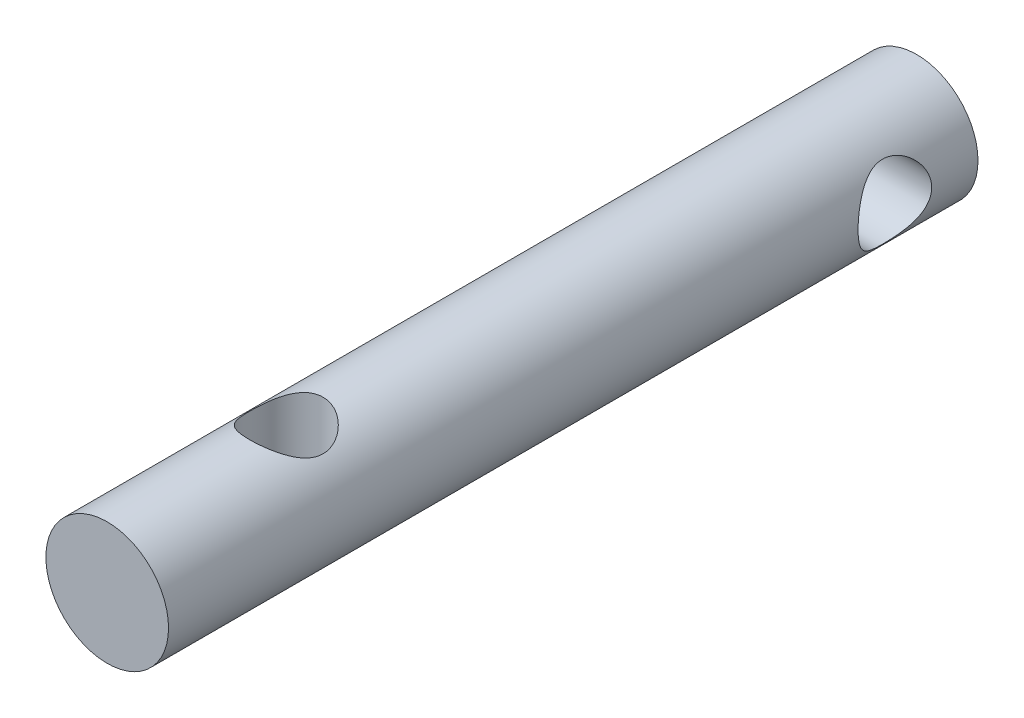
ISO-10303-21;
HEADER;
FILE_DESCRIPTION(('STEP AP214'),'2;1');
FILE_NAME('part.step','',(''),(''),'','','');
FILE_SCHEMA(('AUTOMOTIVE_DESIGN { 1 0 10303 214 1 1 1 1 }'));
ENDSEC;
DATA;
#1=APPLICATION_CONTEXT('core data for automotive mechanical design processes');
#2=APPLICATION_PROTOCOL_DEFINITION('international standard','automotive_design',2000,#1);
#3=PRODUCT_CONTEXT('',#1,'mechanical');
#4=PRODUCT('Part','Part','',(#3));
#5=PRODUCT_RELATED_PRODUCT_CATEGORY('part','',(#4));
#6=PRODUCT_DEFINITION_FORMATION('','',#4);
#7=PRODUCT_DEFINITION_CONTEXT('part definition',#1,'design');
#8=PRODUCT_DEFINITION('design','',#6,#7);
#9=PRODUCT_DEFINITION_SHAPE('','',#8);
#10=(LENGTH_UNIT() NAMED_UNIT(*) SI_UNIT(.MILLI.,.METRE.));
#11=(NAMED_UNIT(*) PLANE_ANGLE_UNIT() SI_UNIT($,.RADIAN.));
#12=(NAMED_UNIT(*) SI_UNIT($,.STERADIAN.) SOLID_ANGLE_UNIT());
#13=UNCERTAINTY_MEASURE_WITH_UNIT(LENGTH_MEASURE(1.E-05),#10,'distance_accuracy_value','');
#14=(GEOMETRIC_REPRESENTATION_CONTEXT(3) GLOBAL_UNCERTAINTY_ASSIGNED_CONTEXT((#13)) GLOBAL_UNIT_ASSIGNED_CONTEXT((#10,
#11,#12)) REPRESENTATION_CONTEXT('',''));
#15=CARTESIAN_POINT('',(0.,0.,0.));
#16=DIRECTION('',(0.,0.,1.));
#17=DIRECTION('',(1.,0.,0.));
#18=AXIS2_PLACEMENT_3D('',#15,#16,#17);
#19=CARTESIAN_POINT('',(0.,0.,41.91));
#20=DIRECTION('',(0.,0.,-1.));
#21=DIRECTION('',(-1.,0.,0.));
#22=AXIS2_PLACEMENT_3D('',#19,#20,#21);
#23=CYLINDRICAL_SURFACE('',#22,3.175);
#24=CARTESIAN_POINT('',(-3.175,0.,2.39813922282772));
#25=CARTESIAN_POINT('',(-3.17499451441265,0.0974450951319126,2.39814527041117));
#26=CARTESIAN_POINT('',(-3.17046469197759,0.195049066210574,2.40566886342358));
#27=CARTESIAN_POINT('',(-3.15277397294736,0.387319379299164,2.43538087952843));
#28=CARTESIAN_POINT('',(-3.1395917927214,0.481977872867109,2.4576054661298));
#29=CARTESIAN_POINT('',(-3.10593173484526,0.665164692998141,2.51546996246125));
#30=CARTESIAN_POINT('',(-3.08549004648014,0.753720871389695,2.55104337606543));
#31=CARTESIAN_POINT('',(-3.03905118293812,0.92332853858211,2.63418182955039));
#32=CARTESIAN_POINT('',(-3.01305538723253,1.00438188370712,2.68174389234177));
#33=CARTESIAN_POINT('',(-2.95535807693063,1.16370007405065,2.79155325763077));
#34=CARTESIAN_POINT('',(-2.9233722597582,1.24127770273718,2.85464541723817));
#35=CARTESIAN_POINT('',(-2.85788657998362,1.3854210370008,2.99182257037374));
#36=CARTESIAN_POINT('',(-2.82438481576972,1.45197239462229,3.06592165268444));
#37=CARTESIAN_POINT('',(-2.75477055048952,1.5804514580127,3.23370208157525));
#38=CARTESIAN_POINT('',(-2.71884162474122,1.64081163277819,3.3286704720845));
#39=CARTESIAN_POINT('',(-2.65351642802893,1.74449025984648,3.52951437073611));
#40=CARTESIAN_POINT('',(-2.62410958890118,1.78783637021075,3.63537182103637));
#41=CARTESIAN_POINT('',(-2.582603796677,1.84709564172948,3.82891671517688));
#42=CARTESIAN_POINT('',(-2.5680401158429,1.86710570502368,3.91481894106806));
#43=CARTESIAN_POINT('',(-2.54749691535738,1.89504538873503,4.08952994192705));
#44=CARTESIAN_POINT('',(-2.54150672347695,1.90299002887476,4.17833496234452));
#45=CARTESIAN_POINT('',(-2.53899571528976,1.90633996170635,4.35649382048514));
#46=CARTESIAN_POINT('',(-2.54249348006119,1.90172064928612,4.44584839269646));
#47=CARTESIAN_POINT('',(-2.55845642033584,1.8801849680819,4.62226326762038));
#48=CARTESIAN_POINT('',(-2.57092834088935,1.86325934967552,4.70932179355387));
#49=CARTESIAN_POINT('',(-2.60290547419199,1.81830880789855,4.87785263033051));
#50=CARTESIAN_POINT('',(-2.6223177379872,1.79043010805925,4.95938258131184));
#51=CARTESIAN_POINT('',(-2.66607355215554,1.72459728448968,5.11682186130641));
#52=CARTESIAN_POINT('',(-2.69041890951801,1.68663946719827,5.1927291167761));
#53=CARTESIAN_POINT('',(-2.7464426563161,1.59407838644418,5.35086902617369));
#54=CARTESIAN_POINT('',(-2.778658950837,1.53772519985107,5.43188740088048));
#55=CARTESIAN_POINT('',(-2.84391861700764,1.41339687835684,5.58415835708483));
#56=CARTESIAN_POINT('',(-2.8769627533293,1.34541063277735,5.65540148397788));
#57=CARTESIAN_POINT('',(-2.94558091297062,1.18848102966636,5.79616770974135));
#58=CARTESIAN_POINT('',(-2.98086572061036,1.09793745703529,5.86406740146803));
#59=CARTESIAN_POINT('',(-3.04510984111155,0.904590584082928,5.98350422276907));
#60=CARTESIAN_POINT('',(-3.07407253390404,0.801793880208324,6.03505010214096));
#61=CARTESIAN_POINT('',(-3.12077597924012,0.59334093329062,6.11661309497851));
#62=CARTESIAN_POINT('',(-3.13910925948424,0.488273882700445,6.14778292458693));
#63=CARTESIAN_POINT('',(-3.16507930373209,0.27311082683369,6.19164344353255));
#64=CARTESIAN_POINT('',(-3.17272889649977,0.163021017189872,6.20435629637476));
#65=CARTESIAN_POINT('',(-3.17615024375755,-0.0428175602592926,6.21005418937917));
#66=CARTESIAN_POINT('',(-3.17339372577143,-0.138483941241767,6.20548346878589));
#67=CARTESIAN_POINT('',(-3.15948964350551,-0.327443340522303,6.18219838942638));
#68=CARTESIAN_POINT('',(-3.14834224937907,-0.420736406907675,6.16348431746434));
#69=CARTESIAN_POINT('',(-3.11905386401582,-0.600170163840149,6.11346906315589));
#70=CARTESIAN_POINT('',(-3.10108950091445,-0.686429603679102,6.08248497950441));
#71=CARTESIAN_POINT('',(-3.05960628695812,-0.852507501340897,6.00915895484383));
#72=CARTESIAN_POINT('',(-3.03608634064869,-0.932324684704436,5.96681477361747));
#73=CARTESIAN_POINT('',(-2.98253780221448,-1.09220795378601,5.86707185923264));
#74=CARTESIAN_POINT('',(-2.95208709479649,-1.17144057107901,5.80856695989806));
#75=CARTESIAN_POINT('',(-2.88892317279907,-1.31956305976505,5.68059215309727));
#76=CARTESIAN_POINT('',(-2.85620735064672,-1.38844071148087,5.61110948616536));
#77=CARTESIAN_POINT('',(-2.78695688365568,-1.52313635853689,5.45260302748012));
#78=CARTESIAN_POINT('',(-2.75048017017815,-1.58738594929295,5.36221268828489));
#79=CARTESIAN_POINT('',(-2.68244551224696,-1.69983453424862,5.17027487162774));
#80=CARTESIAN_POINT('',(-2.6508824045697,-1.74805043804979,5.06873929959001));
#81=CARTESIAN_POINT('',(-2.60330834735534,-1.81791075064868,4.87941058449342));
#82=CARTESIAN_POINT('',(-2.58541087347737,-1.84304464157586,4.79338422611617));
#83=CARTESIAN_POINT('',(-2.55790199294049,-1.88104353179932,4.61742348368211));
#84=CARTESIAN_POINT('',(-2.54827910005326,-1.89392554099576,4.52749469959103));
#85=CARTESIAN_POINT('',(-2.53873567203593,-1.90670345557268,4.34584049931961));
#86=CARTESIAN_POINT('',(-2.53885162089826,-1.90655052898535,4.25410961443148));
#87=CARTESIAN_POINT('',(-2.54886101720431,-1.89314420926951,4.07213328982752));
#88=CARTESIAN_POINT('',(-2.55875978123279,-1.87988369266792,3.98188868496094));
#89=CARTESIAN_POINT('',(-2.5861414527098,-1.84201020214653,3.80975893171572));
#90=CARTESIAN_POINT('',(-2.60323599038313,-1.81797495311049,3.72768051015611));
#91=CARTESIAN_POINT('',(-2.6429398744415,-1.75975320921641,3.56865091254844));
#92=CARTESIAN_POINT('',(-2.66555129712813,-1.7255628914025,3.49170168080599));
#93=CARTESIAN_POINT('',(-2.71796498194149,-1.641973268796,3.33245299167821));
#94=CARTESIAN_POINT('',(-2.74833827007409,-1.59104483080574,3.25114597104719));
#95=CARTESIAN_POINT('',(-2.81076560550976,-1.47797196871254,3.09742658053055));
#96=CARTESIAN_POINT('',(-2.84282102131499,-1.41581830868474,3.02502161818392));
#97=CARTESIAN_POINT('',(-2.911166300656,-1.27012155867849,2.87902329956287));
#98=CARTESIAN_POINT('',(-2.94729305640336,-1.18474305905472,2.8071658826593));
#99=CARTESIAN_POINT('',(-3.01454081025536,-1.00135779697776,2.67868582124472));
#100=CARTESIAN_POINT('',(-3.04566001243498,-0.903346526463002,2.62206863766353));
#101=CARTESIAN_POINT('',(-3.09861734506511,-0.699890837030488,2.52794806363247));
#102=CARTESIAN_POINT('',(-3.12071031004625,-0.594765596238281,2.48991286349252));
#103=CARTESIAN_POINT('',(-3.14589516757997,-0.432421334693446,2.44701967351255));
#104=CARTESIAN_POINT('',(-3.15296108370877,-0.377590720023224,2.43508702224307));
#105=CARTESIAN_POINT('',(-3.16425617194088,-0.266820768171081,2.41608372188658));
#106=CARTESIAN_POINT('',(-3.16848770657978,-0.210882394483744,2.40900902343712));
#107=CARTESIAN_POINT('',(-3.17248369797034,-0.128982982915142,2.40233545062428));
#108=CARTESIAN_POINT('',(-3.17342617833636,-0.103222017768107,2.40076306812948));
#109=CARTESIAN_POINT('',(-3.17468506718656,-0.0516444234298966,2.39866413463696));
#110=CARTESIAN_POINT('',(-3.17500145395323,-0.0258277923389148,2.3981376199176));
#111=CARTESIAN_POINT('',(-3.175,0.,2.39813922282772));
#112=B_SPLINE_CURVE_WITH_KNOTS('',3,(#24,#25,#26,#27,#28,#29,#30,#31,#32,#33,#34,#35,#36,#37,
#38,#39,#40,#41,#42,#43,#44,#45,#46,#47,#48,#49,#50,#51,#52,#53,#54,#55,#56,#57,#58,#59,#60,#61,
#62,#63,#64,#65,#66,#67,#68,#69,#70,#71,#72,#73,#74,#75,#76,#77,#78,#79,#80,#81,#82,#83,#84,#85,
#86,#87,#88,#89,#90,#91,#92,#93,#94,#95,#96,#97,#98,#99,#100,#101,#102,#103,#104,#105,#106,#107,
#108,#109,#110,#111),.UNSPECIFIED.,.T.,.F.,(4,2,2,2,2,2,2,2,2,2,2,2,2,2,2,2,2,2,2,2,2,2,2,2,2,2,
2,2,2,2,2,2,2,2,2,2,2,2,2,2,2,2,2,4),(0.,0.292229841686784,0.585181236950415,0.876692283442014,
1.16813101145019,1.4818562023024,1.79598647577196,2.14863442751055,2.50070671678956,
2.76775963916654,3.03447984564054,3.30172277005822,3.56916676657818,3.83315549843373,
4.09724110458533,4.40749683935957,4.71805056900666,5.07188416513558,5.42552812879662,
5.7568692418463,6.08781214386159,6.37382015457481,6.65982236566588,6.9388708782601,
7.21797445986962,7.52603734589319,7.83446096403931,8.18307688283571,8.53132396622898,
8.80437389889659,9.07704418691314,9.35073600737339,9.6245766506777,9.88522404880549,
10.1459696943425,10.446748347664,10.7477756135016,11.0979497595491,11.4482492146062,
11.787830811676,11.9572649902265,12.1265577643591,12.2040105069734,12.2814659361677),.UNSPECIFIED.);
#113=CARTESIAN_POINT('',(-3.175,0.,2.39813922282772));
#114=VERTEX_POINT('',#113);
#115=EDGE_CURVE('E10',#114,#114,#112,.T.);
#116=ORIENTED_EDGE('',*,*,#115,.T.);
#117=EDGE_LOOP('',(#116));
#118=FACE_BOUND('',#117,.T.);
#119=CARTESIAN_POINT('',(3.175,0.,2.39813922282772));
#120=CARTESIAN_POINT('',(3.17499451441265,-0.0974450951319126,2.39814527041117));
#121=CARTESIAN_POINT('',(3.17046469197759,-0.195049066210574,2.40566886342358));
#122=CARTESIAN_POINT('',(3.15277397294736,-0.387319379299164,2.43538087952843));
#123=CARTESIAN_POINT('',(3.1395917927214,-0.481977872867109,2.4576054661298));
#124=CARTESIAN_POINT('',(3.10593173484526,-0.665164692998141,2.51546996246125));
#125=CARTESIAN_POINT('',(3.08549004648014,-0.753720871389695,2.55104337606543));
#126=CARTESIAN_POINT('',(3.03905118293812,-0.92332853858211,2.63418182955039));
#127=CARTESIAN_POINT('',(3.01305538723253,-1.00438188370712,2.68174389234177));
#128=CARTESIAN_POINT('',(2.95535807693063,-1.16370007405065,2.79155325763077));
#129=CARTESIAN_POINT('',(2.9233722597582,-1.24127770273718,2.85464541723817));
#130=CARTESIAN_POINT('',(2.85788657998362,-1.3854210370008,2.99182257037374));
#131=CARTESIAN_POINT('',(2.82438481576972,-1.45197239462229,3.06592165268444));
#132=CARTESIAN_POINT('',(2.75477055048952,-1.5804514580127,3.23370208157525));
#133=CARTESIAN_POINT('',(2.71884162474122,-1.64081163277819,3.3286704720845));
#134=CARTESIAN_POINT('',(2.65351642802893,-1.74449025984648,3.52951437073611));
#135=CARTESIAN_POINT('',(2.62410958890118,-1.78783637021075,3.63537182103637));
#136=CARTESIAN_POINT('',(2.582603796677,-1.84709564172948,3.82891671517688));
#137=CARTESIAN_POINT('',(2.5680401158429,-1.86710570502368,3.91481894106806));
#138=CARTESIAN_POINT('',(2.54749691535738,-1.89504538873503,4.08952994192705));
#139=CARTESIAN_POINT('',(2.54150672347695,-1.90299002887476,4.17833496234452));
#140=CARTESIAN_POINT('',(2.53899571528976,-1.90633996170635,4.35649382048514));
#141=CARTESIAN_POINT('',(2.54249348006119,-1.90172064928612,4.44584839269646));
#142=CARTESIAN_POINT('',(2.55845642033584,-1.8801849680819,4.62226326762038));
#143=CARTESIAN_POINT('',(2.57092834088935,-1.86325934967552,4.70932179355387));
#144=CARTESIAN_POINT('',(2.60290547419199,-1.81830880789855,4.87785263033051));
#145=CARTESIAN_POINT('',(2.6223177379872,-1.79043010805925,4.95938258131184));
#146=CARTESIAN_POINT('',(2.66607355215554,-1.72459728448968,5.11682186130641));
#147=CARTESIAN_POINT('',(2.69041890951801,-1.68663946719827,5.1927291167761));
#148=CARTESIAN_POINT('',(2.7464426563161,-1.59407838644418,5.35086902617369));
#149=CARTESIAN_POINT('',(2.778658950837,-1.53772519985107,5.43188740088048));
#150=CARTESIAN_POINT('',(2.84391861700764,-1.41339687835684,5.58415835708483));
#151=CARTESIAN_POINT('',(2.8769627533293,-1.34541063277735,5.65540148397788));
#152=CARTESIAN_POINT('',(2.94558091297062,-1.18848102966636,5.79616770974135));
#153=CARTESIAN_POINT('',(2.98086572061036,-1.09793745703529,5.86406740146803));
#154=CARTESIAN_POINT('',(3.04510984111155,-0.904590584082928,5.98350422276907));
#155=CARTESIAN_POINT('',(3.07407253390404,-0.801793880208324,6.03505010214096));
#156=CARTESIAN_POINT('',(3.12077597924012,-0.59334093329062,6.11661309497851));
#157=CARTESIAN_POINT('',(3.13910925948424,-0.488273882700445,6.14778292458693));
#158=CARTESIAN_POINT('',(3.16507930373209,-0.27311082683369,6.19164344353255));
#159=CARTESIAN_POINT('',(3.17272889649977,-0.163021017189872,6.20435629637476));
#160=CARTESIAN_POINT('',(3.17615024375755,0.0428175602592926,6.21005418937917));
#161=CARTESIAN_POINT('',(3.17339372577143,0.138483941241767,6.20548346878589));
#162=CARTESIAN_POINT('',(3.15948964350551,0.327443340522303,6.18219838942638));
#163=CARTESIAN_POINT('',(3.14834224937907,0.420736406907675,6.16348431746434));
#164=CARTESIAN_POINT('',(3.11905386401582,0.600170163840149,6.11346906315589));
#165=CARTESIAN_POINT('',(3.10108950091445,0.686429603679102,6.08248497950441));
#166=CARTESIAN_POINT('',(3.05960628695812,0.852507501340897,6.00915895484383));
#167=CARTESIAN_POINT('',(3.03608634064869,0.932324684704436,5.96681477361747));
#168=CARTESIAN_POINT('',(2.98253780221448,1.09220795378601,5.86707185923264));
#169=CARTESIAN_POINT('',(2.95208709479649,1.17144057107901,5.80856695989806));
#170=CARTESIAN_POINT('',(2.88892317279907,1.31956305976505,5.68059215309727));
#171=CARTESIAN_POINT('',(2.85620735064672,1.38844071148087,5.61110948616536));
#172=CARTESIAN_POINT('',(2.78695688365568,1.52313635853689,5.45260302748012));
#173=CARTESIAN_POINT('',(2.75048017017815,1.58738594929295,5.36221268828489));
#174=CARTESIAN_POINT('',(2.68244551224696,1.69983453424862,5.17027487162774));
#175=CARTESIAN_POINT('',(2.6508824045697,1.74805043804979,5.06873929959001));
#176=CARTESIAN_POINT('',(2.60330834735534,1.81791075064868,4.87941058449342));
#177=CARTESIAN_POINT('',(2.58541087347737,1.84304464157586,4.79338422611617));
#178=CARTESIAN_POINT('',(2.55790199294049,1.88104353179932,4.61742348368211));
#179=CARTESIAN_POINT('',(2.54827910005326,1.89392554099576,4.52749469959103));
#180=CARTESIAN_POINT('',(2.53873567203593,1.90670345557268,4.34584049931961));
#181=CARTESIAN_POINT('',(2.53885162089826,1.90655052898535,4.25410961443148));
#182=CARTESIAN_POINT('',(2.54886101720431,1.89314420926951,4.07213328982752));
#183=CARTESIAN_POINT('',(2.55875978123279,1.87988369266792,3.98188868496094));
#184=CARTESIAN_POINT('',(2.5861414527098,1.84201020214653,3.80975893171572));
#185=CARTESIAN_POINT('',(2.60323599038313,1.81797495311049,3.72768051015611));
#186=CARTESIAN_POINT('',(2.6429398744415,1.75975320921641,3.56865091254844));
#187=CARTESIAN_POINT('',(2.66555129712813,1.7255628914025,3.49170168080599));
#188=CARTESIAN_POINT('',(2.71796498194149,1.641973268796,3.33245299167821));
#189=CARTESIAN_POINT('',(2.74833827007409,1.59104483080574,3.25114597104719));
#190=CARTESIAN_POINT('',(2.81076560550976,1.47797196871254,3.09742658053055));
#191=CARTESIAN_POINT('',(2.84282102131499,1.41581830868474,3.02502161818392));
#192=CARTESIAN_POINT('',(2.911166300656,1.27012155867849,2.87902329956287));
#193=CARTESIAN_POINT('',(2.94729305640336,1.18474305905472,2.8071658826593));
#194=CARTESIAN_POINT('',(3.01454081025536,1.00135779697776,2.67868582124472));
#195=CARTESIAN_POINT('',(3.04566001243498,0.903346526463002,2.62206863766353));
#196=CARTESIAN_POINT('',(3.09861734506511,0.699890837030488,2.52794806363247));
#197=CARTESIAN_POINT('',(3.12071031004625,0.594765596238281,2.48991286349252));
#198=CARTESIAN_POINT('',(3.14589516757997,0.432421334693446,2.44701967351255));
#199=CARTESIAN_POINT('',(3.15296108370877,0.377590720023224,2.43508702224307));
#200=CARTESIAN_POINT('',(3.16425617194088,0.266820768171081,2.41608372188658));
#201=CARTESIAN_POINT('',(3.16848770657978,0.210882394483744,2.40900902343712));
#202=CARTESIAN_POINT('',(3.17248369797034,0.128982982915142,2.40233545062428));
#203=CARTESIAN_POINT('',(3.17342617833636,0.103222017768107,2.40076306812948));
#204=CARTESIAN_POINT('',(3.17468506718656,0.0516444234298966,2.39866413463696));
#205=CARTESIAN_POINT('',(3.17500145395323,0.0258277923389148,2.3981376199176));
#206=CARTESIAN_POINT('',(3.175,0.,2.39813922282772));
#207=B_SPLINE_CURVE_WITH_KNOTS('',3,(#119,#120,#121,#122,#123,#124,#125,#126,#127,#128,#129,
#130,#131,#132,#133,#134,#135,#136,#137,#138,#139,#140,#141,#142,#143,#144,#145,#146,#147,#148,
#149,#150,#151,#152,#153,#154,#155,#156,#157,#158,#159,#160,#161,#162,#163,#164,#165,#166,#167,
#168,#169,#170,#171,#172,#173,#174,#175,#176,#177,#178,#179,#180,#181,#182,#183,#184,#185,#186,
#187,#188,#189,#190,#191,#192,#193,#194,#195,#196,#197,#198,#199,#200,#201,#202,#203,#204,#205,
#206),.UNSPECIFIED.,.T.,.F.,(4,2,2,2,2,2,2,2,2,2,2,2,2,2,2,2,2,2,2,2,2,2,2,2,2,2,2,2,2,2,2,2,2,
2,2,2,2,2,2,2,2,2,2,4),(0.,0.292229841686784,0.585181236950415,0.876692283442014,
1.16813101145019,1.4818562023024,1.79598647577196,2.14863442751055,2.50070671678956,
2.76775963916654,3.03447984564054,3.30172277005822,3.56916676657818,3.83315549843373,
4.09724110458533,4.40749683935957,4.71805056900666,5.07188416513558,5.42552812879662,
5.7568692418463,6.08781214386159,6.37382015457481,6.65982236566588,6.9388708782601,
7.21797445986962,7.52603734589319,7.83446096403931,8.18307688283571,8.53132396622898,
8.80437389889659,9.07704418691314,9.35073600737339,9.6245766506777,9.88522404880549,
10.1459696943425,10.446748347664,10.7477756135016,11.0979497595491,11.4482492146062,
11.787830811676,11.9572649902265,12.1265577643591,12.2040105069734,12.2814659361677),.UNSPECIFIED.);
#208=CARTESIAN_POINT('',(3.175,0.,2.39813922282772));
#209=VERTEX_POINT('',#208);
#210=EDGE_CURVE('E53',#209,#209,#207,.T.);
#211=ORIENTED_EDGE('',*,*,#210,.T.);
#212=EDGE_LOOP('',(#211));
#213=FACE_BOUND('',#212,.T.);
#214=CARTESIAN_POINT('',(0.,-3.175,34.544));
#215=CARTESIAN_POINT('',(0.0974450951319128,-3.17499451441265,34.5439939524165));
#216=CARTESIAN_POINT('',(0.195049066210575,-3.17046469197759,34.5364703594041));
#217=CARTESIAN_POINT('',(0.387319379299164,-3.15277397294736,34.5067583432993));
#218=CARTESIAN_POINT('',(0.481977872867109,-3.1395917927214,34.4845337566979));
#219=CARTESIAN_POINT('',(0.66516469299814,-3.10593173484526,34.4266692603665));
#220=CARTESIAN_POINT('',(0.753720871389693,-3.08549004648014,34.3910958467623));
#221=CARTESIAN_POINT('',(0.923328538582108,-3.03905118293812,34.3079573932773));
#222=CARTESIAN_POINT('',(1.00438188370712,-3.01305538723253,34.260395330486));
#223=CARTESIAN_POINT('',(1.16370007405065,-2.95535807693063,34.1505859651969));
#224=CARTESIAN_POINT('',(1.24127770273718,-2.9233722597582,34.0874938055896));
#225=CARTESIAN_POINT('',(1.3854210370008,-2.85788657998362,33.950316652454));
#226=CARTESIAN_POINT('',(1.45197239462229,-2.82438481576973,33.8762175701433));
#227=CARTESIAN_POINT('',(1.5804514580127,-2.75477055048952,33.7084371412525));
#228=CARTESIAN_POINT('',(1.6408116327782,-2.71884162474122,33.6134687507432));
#229=CARTESIAN_POINT('',(1.74449025984648,-2.65351642802893,33.4126248520916));
#230=CARTESIAN_POINT('',(1.78783637021075,-2.62410958890118,33.3067674017914));
#231=CARTESIAN_POINT('',(1.84709564172948,-2.582603796677,33.1132225076508));
#232=CARTESIAN_POINT('',(1.86710570502368,-2.5680401158429,33.0273202817597));
#233=CARTESIAN_POINT('',(1.89504538873503,-2.54749691535738,32.8526092809007));
#234=CARTESIAN_POINT('',(1.90299002887476,-2.54150672347695,32.7638042604832));
#235=CARTESIAN_POINT('',(1.90633996170635,-2.53899571528976,32.5856454023426));
#236=CARTESIAN_POINT('',(1.90172064928612,-2.54249348006119,32.4962908301313));
#237=CARTESIAN_POINT('',(1.8801849680819,-2.55845642033584,32.3198759552073));
#238=CARTESIAN_POINT('',(1.86325934967551,-2.57092834088936,32.2328174292738));
#239=CARTESIAN_POINT('',(1.81830880789855,-2.602905474192,32.0642865924972));
#240=CARTESIAN_POINT('',(1.79043010805924,-2.6223177379872,31.9827566415159));
#241=CARTESIAN_POINT('',(1.72459728448968,-2.66607355215555,31.8253173615213));
#242=CARTESIAN_POINT('',(1.68663946719826,-2.69041890951801,31.7494101060516));
#243=CARTESIAN_POINT('',(1.59407838644417,-2.74644265631611,31.591270196654));
#244=CARTESIAN_POINT('',(1.53772519985107,-2.778658950837,31.5102518219472));
#245=CARTESIAN_POINT('',(1.41339687835683,-2.84391861700765,31.3579808657429));
#246=CARTESIAN_POINT('',(1.34541063277734,-2.8769627533293,31.2867377388498));
#247=CARTESIAN_POINT('',(1.18848102966635,-2.94558091297063,31.1459715130864));
#248=CARTESIAN_POINT('',(1.09793745703528,-2.98086572061037,31.0780718213597));
#249=CARTESIAN_POINT('',(0.904590584082919,-3.04510984111156,30.9586350000586));
#250=CARTESIAN_POINT('',(0.801793880208314,-3.07407253390405,30.9070891206868));
#251=CARTESIAN_POINT('',(0.593340933290609,-3.12077597924012,30.8255261278492));
#252=CARTESIAN_POINT('',(0.488273882700435,-3.13910925948424,30.7943562982408));
#253=CARTESIAN_POINT('',(0.27311082683368,-3.16507930373209,30.7504957792952));
#254=CARTESIAN_POINT('',(0.163021017189862,-3.17272889649977,30.737782926453));
#255=CARTESIAN_POINT('',(-0.0428175602593023,-3.17615024375755,30.7320850334485));
#256=CARTESIAN_POINT('',(-0.138483941241776,-3.17339372577143,30.7366557540418));
#257=CARTESIAN_POINT('',(-0.327443340522312,-3.15948964350551,30.7599408334013));
#258=CARTESIAN_POINT('',(-0.420736406907684,-3.14834224937907,30.7786549053634));
#259=CARTESIAN_POINT('',(-0.600170163840158,-3.11905386401582,30.8286701596718));
#260=CARTESIAN_POINT('',(-0.68642960367911,-3.10108950091445,30.8596542433233));
#261=CARTESIAN_POINT('',(-0.852507501340905,-3.05960628695812,30.9329802679839));
#262=CARTESIAN_POINT('',(-0.932324684704443,-3.03608634064869,30.9753244492103));
#263=CARTESIAN_POINT('',(-1.09220795378601,-2.98253780221448,31.0750673635951));
#264=CARTESIAN_POINT('',(-1.17144057107902,-2.95208709479649,31.1335722629297));
#265=CARTESIAN_POINT('',(-1.31956305976505,-2.88892317279907,31.2615470697305));
#266=CARTESIAN_POINT('',(-1.38844071148087,-2.85620735064672,31.3310297366624));
#267=CARTESIAN_POINT('',(-1.52313635853689,-2.78695688365568,31.4895361953476));
#268=CARTESIAN_POINT('',(-1.58738594929296,-2.75048017017815,31.5799265345428));
#269=CARTESIAN_POINT('',(-1.69983453424862,-2.68244551224696,31.7718643512));
#270=CARTESIAN_POINT('',(-1.74805043804979,-2.6508824045697,31.8733999232377));
#271=CARTESIAN_POINT('',(-1.81791075064868,-2.60330834735534,32.0627286383343));
#272=CARTESIAN_POINT('',(-1.84304464157587,-2.58541087347737,32.1487549967116));
#273=CARTESIAN_POINT('',(-1.88104353179932,-2.55790199294049,32.3247157391456));
#274=CARTESIAN_POINT('',(-1.89392554099576,-2.54827910005326,32.4146445232367));
#275=CARTESIAN_POINT('',(-1.90670345557268,-2.53873567203593,32.5962987235081));
#276=CARTESIAN_POINT('',(-1.90655052898535,-2.53885162089826,32.6880296083963));
#277=CARTESIAN_POINT('',(-1.8931442092695,-2.54886101720432,32.8700059330002));
#278=CARTESIAN_POINT('',(-1.87988369266791,-2.5587597812328,32.9602505378668));
#279=CARTESIAN_POINT('',(-1.84201020214653,-2.5861414527098,33.132380291112));
#280=CARTESIAN_POINT('',(-1.81797495311048,-2.60323599038313,33.2144587126716));
#281=CARTESIAN_POINT('',(-1.75975320921641,-2.64293987444151,33.3734883102793));
#282=CARTESIAN_POINT('',(-1.7255628914025,-2.66555129712814,33.4504375420217));
#283=CARTESIAN_POINT('',(-1.64197326879599,-2.71796498194149,33.6096862311495));
#284=CARTESIAN_POINT('',(-1.59104483080573,-2.74833827007409,33.6909932517805));
#285=CARTESIAN_POINT('',(-1.47797196871253,-2.81076560550976,33.8447126422972));
#286=CARTESIAN_POINT('',(-1.41581830868473,-2.842821021315,33.9171176046438));
#287=CARTESIAN_POINT('',(-1.27012155867848,-2.91116630065601,34.0631159232649));
#288=CARTESIAN_POINT('',(-1.18474305905471,-2.94729305640336,34.1349733401684));
#289=CARTESIAN_POINT('',(-1.00135779697775,-3.01454081025536,34.263453401583));
#290=CARTESIAN_POINT('',(-0.903346526462988,-3.04566001243499,34.3200705851642));
#291=CARTESIAN_POINT('',(-0.699890837030474,-3.09861734506511,34.4141911591953));
#292=CARTESIAN_POINT('',(-0.594765596238268,-3.12071031004625,34.4522263593352));
#293=CARTESIAN_POINT('',(-0.432421334693433,-3.14589516757997,34.4951195493152));
#294=CARTESIAN_POINT('',(-0.377590720023212,-3.15296108370877,34.5070522005847));
#295=CARTESIAN_POINT('',(-0.266820768171068,-3.16425617194088,34.5260555009411));
#296=CARTESIAN_POINT('',(-0.210882394483731,-3.16848770657979,34.5331301993906));
#297=CARTESIAN_POINT('',(-0.12898298291513,-3.17248369797034,34.5398037722034));
#298=CARTESIAN_POINT('',(-0.103222017768097,-3.17342617833636,34.5413761546982));
#299=CARTESIAN_POINT('',(-0.0516444234298917,-3.17468506718656,34.5434750881908));
#300=CARTESIAN_POINT('',(-0.0258277923389124,-3.17500145395323,34.5440016029101));
#301=CARTESIAN_POINT('',(0.,-3.175,34.544));
#302=B_SPLINE_CURVE_WITH_KNOTS('',3,(#214,#215,#216,#217,#218,#219,#220,#221,#222,#223,#224,
#225,#226,#227,#228,#229,#230,#231,#232,#233,#234,#235,#236,#237,#238,#239,#240,#241,#242,#243,
#244,#245,#246,#247,#248,#249,#250,#251,#252,#253,#254,#255,#256,#257,#258,#259,#260,#261,#262,
#263,#264,#265,#266,#267,#268,#269,#270,#271,#272,#273,#274,#275,#276,#277,#278,#279,#280,#281,
#282,#283,#284,#285,#286,#287,#288,#289,#290,#291,#292,#293,#294,#295,#296,#297,#298,#299,#300,
#301),.UNSPECIFIED.,.T.,.F.,(4,2,2,2,2,2,2,2,2,2,2,2,2,2,2,2,2,2,2,2,2,2,2,2,2,2,2,2,2,2,2,2,2,
2,2,2,2,2,2,2,2,2,2,4),(0.,0.292229841686785,0.585181236950415,0.876692283442011,
1.16813101145019,1.4818562023024,1.79598647577196,2.14863442751055,2.50070671678956,
2.76775963916654,3.03447984564054,3.30172277005823,3.56916676657819,3.83315549843374,
4.09724110458534,4.40749683935957,4.71805056900667,5.07188416513559,5.42552812879663,
5.75686924184631,6.0878121438616,6.37382015457482,6.65982236566589,6.93887087826011,
7.21797445986962,7.5260373458932,7.83446096403932,8.18307688283572,8.53132396622899,
8.8043738988966,9.07704418691314,9.35073600737341,9.62457665067772,9.88522404880551,
10.1459696943426,10.446748347664,10.7477756135016,11.0979497595491,11.4482492146062,
11.787830811676,11.9572649902265,12.1265577643592,12.2040105069734,12.2814659361677),.UNSPECIFIED.);
#303=CARTESIAN_POINT('',(0.,-3.175,34.544));
#304=VERTEX_POINT('',#303);
#305=EDGE_CURVE('E58',#304,#304,#302,.T.);
#306=ORIENTED_EDGE('',*,*,#305,.T.);
#307=EDGE_LOOP('',(#306));
#308=FACE_BOUND('',#307,.T.);
#309=CARTESIAN_POINT('',(0.,3.175,34.544));
#310=CARTESIAN_POINT('',(-0.0974450951319128,3.17499451441265,34.5439939524165));
#311=CARTESIAN_POINT('',(-0.195049066210575,3.17046469197759,34.5364703594041));
#312=CARTESIAN_POINT('',(-0.387319379299164,3.15277397294736,34.5067583432993));
#313=CARTESIAN_POINT('',(-0.481977872867109,3.1395917927214,34.4845337566979));
#314=CARTESIAN_POINT('',(-0.66516469299814,3.10593173484526,34.4266692603665));
#315=CARTESIAN_POINT('',(-0.753720871389693,3.08549004648014,34.3910958467623));
#316=CARTESIAN_POINT('',(-0.923328538582108,3.03905118293812,34.3079573932773));
#317=CARTESIAN_POINT('',(-1.00438188370712,3.01305538723253,34.260395330486));
#318=CARTESIAN_POINT('',(-1.16370007405065,2.95535807693063,34.1505859651969));
#319=CARTESIAN_POINT('',(-1.24127770273718,2.9233722597582,34.0874938055896));
#320=CARTESIAN_POINT('',(-1.3854210370008,2.85788657998362,33.950316652454));
#321=CARTESIAN_POINT('',(-1.45197239462229,2.82438481576973,33.8762175701433));
#322=CARTESIAN_POINT('',(-1.5804514580127,2.75477055048952,33.7084371412525));
#323=CARTESIAN_POINT('',(-1.6408116327782,2.71884162474122,33.6134687507432));
#324=CARTESIAN_POINT('',(-1.74449025984648,2.65351642802893,33.4126248520916));
#325=CARTESIAN_POINT('',(-1.78783637021075,2.62410958890118,33.3067674017914));
#326=CARTESIAN_POINT('',(-1.84709564172948,2.582603796677,33.1132225076508));
#327=CARTESIAN_POINT('',(-1.86710570502368,2.5680401158429,33.0273202817597));
#328=CARTESIAN_POINT('',(-1.89504538873503,2.54749691535738,32.8526092809007));
#329=CARTESIAN_POINT('',(-1.90299002887476,2.54150672347695,32.7638042604832));
#330=CARTESIAN_POINT('',(-1.90633996170635,2.53899571528976,32.5856454023426));
#331=CARTESIAN_POINT('',(-1.90172064928612,2.54249348006119,32.4962908301313));
#332=CARTESIAN_POINT('',(-1.8801849680819,2.55845642033584,32.3198759552073));
#333=CARTESIAN_POINT('',(-1.86325934967551,2.57092834088936,32.2328174292738));
#334=CARTESIAN_POINT('',(-1.81830880789855,2.602905474192,32.0642865924972));
#335=CARTESIAN_POINT('',(-1.79043010805924,2.6223177379872,31.9827566415159));
#336=CARTESIAN_POINT('',(-1.72459728448968,2.66607355215555,31.8253173615213));
#337=CARTESIAN_POINT('',(-1.68663946719826,2.69041890951801,31.7494101060516));
#338=CARTESIAN_POINT('',(-1.59407838644417,2.74644265631611,31.591270196654));
#339=CARTESIAN_POINT('',(-1.53772519985107,2.778658950837,31.5102518219472));
#340=CARTESIAN_POINT('',(-1.41339687835683,2.84391861700765,31.3579808657429));
#341=CARTESIAN_POINT('',(-1.34541063277734,2.8769627533293,31.2867377388498));
#342=CARTESIAN_POINT('',(-1.18848102966635,2.94558091297063,31.1459715130864));
#343=CARTESIAN_POINT('',(-1.09793745703528,2.98086572061037,31.0780718213597));
#344=CARTESIAN_POINT('',(-0.904590584082919,3.04510984111156,30.9586350000586));
#345=CARTESIAN_POINT('',(-0.801793880208314,3.07407253390405,30.9070891206868));
#346=CARTESIAN_POINT('',(-0.593340933290609,3.12077597924012,30.8255261278492));
#347=CARTESIAN_POINT('',(-0.488273882700435,3.13910925948424,30.7943562982408));
#348=CARTESIAN_POINT('',(-0.27311082683368,3.16507930373209,30.7504957792952));
#349=CARTESIAN_POINT('',(-0.163021017189862,3.17272889649977,30.737782926453));
#350=CARTESIAN_POINT('',(0.0428175602593023,3.17615024375755,30.7320850334485));
#351=CARTESIAN_POINT('',(0.138483941241776,3.17339372577143,30.7366557540418));
#352=CARTESIAN_POINT('',(0.327443340522312,3.15948964350551,30.7599408334013));
#353=CARTESIAN_POINT('',(0.420736406907684,3.14834224937907,30.7786549053634));
#354=CARTESIAN_POINT('',(0.600170163840158,3.11905386401582,30.8286701596718));
#355=CARTESIAN_POINT('',(0.68642960367911,3.10108950091445,30.8596542433233));
#356=CARTESIAN_POINT('',(0.852507501340905,3.05960628695812,30.9329802679839));
#357=CARTESIAN_POINT('',(0.932324684704443,3.03608634064869,30.9753244492103));
#358=CARTESIAN_POINT('',(1.09220795378601,2.98253780221448,31.0750673635951));
#359=CARTESIAN_POINT('',(1.17144057107902,2.95208709479649,31.1335722629297));
#360=CARTESIAN_POINT('',(1.31956305976505,2.88892317279907,31.2615470697305));
#361=CARTESIAN_POINT('',(1.38844071148087,2.85620735064672,31.3310297366624));
#362=CARTESIAN_POINT('',(1.52313635853689,2.78695688365568,31.4895361953476));
#363=CARTESIAN_POINT('',(1.58738594929296,2.75048017017815,31.5799265345428));
#364=CARTESIAN_POINT('',(1.69983453424862,2.68244551224696,31.7718643512));
#365=CARTESIAN_POINT('',(1.74805043804979,2.6508824045697,31.8733999232377));
#366=CARTESIAN_POINT('',(1.81791075064868,2.60330834735534,32.0627286383343));
#367=CARTESIAN_POINT('',(1.84304464157587,2.58541087347737,32.1487549967116));
#368=CARTESIAN_POINT('',(1.88104353179932,2.55790199294049,32.3247157391456));
#369=CARTESIAN_POINT('',(1.89392554099576,2.54827910005326,32.4146445232367));
#370=CARTESIAN_POINT('',(1.90670345557268,2.53873567203593,32.5962987235081));
#371=CARTESIAN_POINT('',(1.90655052898535,2.53885162089826,32.6880296083963));
#372=CARTESIAN_POINT('',(1.8931442092695,2.54886101720432,32.8700059330002));
#373=CARTESIAN_POINT('',(1.87988369266791,2.5587597812328,32.9602505378668));
#374=CARTESIAN_POINT('',(1.84201020214653,2.5861414527098,33.132380291112));
#375=CARTESIAN_POINT('',(1.81797495311048,2.60323599038313,33.2144587126716));
#376=CARTESIAN_POINT('',(1.75975320921641,2.64293987444151,33.3734883102793));
#377=CARTESIAN_POINT('',(1.7255628914025,2.66555129712814,33.4504375420217));
#378=CARTESIAN_POINT('',(1.64197326879599,2.71796498194149,33.6096862311495));
#379=CARTESIAN_POINT('',(1.59104483080573,2.74833827007409,33.6909932517805));
#380=CARTESIAN_POINT('',(1.47797196871253,2.81076560550976,33.8447126422972));
#381=CARTESIAN_POINT('',(1.41581830868473,2.842821021315,33.9171176046438));
#382=CARTESIAN_POINT('',(1.27012155867848,2.91116630065601,34.0631159232649));
#383=CARTESIAN_POINT('',(1.18474305905471,2.94729305640336,34.1349733401684));
#384=CARTESIAN_POINT('',(1.00135779697775,3.01454081025536,34.263453401583));
#385=CARTESIAN_POINT('',(0.903346526462988,3.04566001243499,34.3200705851642));
#386=CARTESIAN_POINT('',(0.699890837030474,3.09861734506511,34.4141911591953));
#387=CARTESIAN_POINT('',(0.594765596238268,3.12071031004625,34.4522263593352));
#388=CARTESIAN_POINT('',(0.432421334693433,3.14589516757997,34.4951195493152));
#389=CARTESIAN_POINT('',(0.377590720023212,3.15296108370877,34.5070522005847));
#390=CARTESIAN_POINT('',(0.266820768171068,3.16425617194088,34.5260555009411));
#391=CARTESIAN_POINT('',(0.210882394483731,3.16848770657979,34.5331301993906));
#392=CARTESIAN_POINT('',(0.12898298291513,3.17248369797034,34.5398037722034));
#393=CARTESIAN_POINT('',(0.103222017768097,3.17342617833636,34.5413761546982));
#394=CARTESIAN_POINT('',(0.0516444234298917,3.17468506718656,34.5434750881908));
#395=CARTESIAN_POINT('',(0.0258277923389124,3.17500145395323,34.5440016029101));
#396=CARTESIAN_POINT('',(0.,3.175,34.544));
#397=B_SPLINE_CURVE_WITH_KNOTS('',3,(#309,#310,#311,#312,#313,#314,#315,#316,#317,#318,#319,
#320,#321,#322,#323,#324,#325,#326,#327,#328,#329,#330,#331,#332,#333,#334,#335,#336,#337,#338,
#339,#340,#341,#342,#343,#344,#345,#346,#347,#348,#349,#350,#351,#352,#353,#354,#355,#356,#357,
#358,#359,#360,#361,#362,#363,#364,#365,#366,#367,#368,#369,#370,#371,#372,#373,#374,#375,#376,
#377,#378,#379,#380,#381,#382,#383,#384,#385,#386,#387,#388,#389,#390,#391,#392,#393,#394,#395,
#396),.UNSPECIFIED.,.T.,.F.,(4,2,2,2,2,2,2,2,2,2,2,2,2,2,2,2,2,2,2,2,2,2,2,2,2,2,2,2,2,2,2,2,2,
2,2,2,2,2,2,2,2,2,2,4),(0.,0.292229841686785,0.585181236950415,0.876692283442011,
1.16813101145019,1.4818562023024,1.79598647577196,2.14863442751055,2.50070671678956,
2.76775963916654,3.03447984564054,3.30172277005823,3.56916676657819,3.83315549843374,
4.09724110458534,4.40749683935957,4.71805056900667,5.07188416513559,5.42552812879663,
5.75686924184631,6.0878121438616,6.37382015457482,6.65982236566589,6.93887087826011,
7.21797445986962,7.5260373458932,7.83446096403932,8.18307688283572,8.53132396622899,
8.8043738988966,9.07704418691314,9.35073600737341,9.62457665067772,9.88522404880551,
10.1459696943426,10.446748347664,10.7477756135016,11.0979497595491,11.4482492146062,
11.787830811676,11.9572649902265,12.1265577643592,12.2040105069734,12.2814659361677),.UNSPECIFIED.);
#398=CARTESIAN_POINT('',(0.,3.175,34.544));
#399=VERTEX_POINT('',#398);
#400=EDGE_CURVE('E63',#399,#399,#397,.T.);
#401=ORIENTED_EDGE('',*,*,#400,.T.);
#402=EDGE_LOOP('',(#401));
#403=FACE_BOUND('',#402,.T.);
#404=CARTESIAN_POINT('',(0.,0.,41.91));
#405=DIRECTION('',(0.,0.,1.));
#406=DIRECTION('',(1.,0.,0.));
#407=AXIS2_PLACEMENT_3D('',#404,#405,#406);
#408=CIRCLE('',#407,3.175);
#409=CARTESIAN_POINT('',(3.175,0.,41.91));
#410=VERTEX_POINT('',#409);
#411=EDGE_CURVE('E92',#410,#410,#408,.T.);
#412=ORIENTED_EDGE('',*,*,#411,.F.);
#413=EDGE_LOOP('',(#412));
#414=FACE_BOUND('',#413,.T.);
#415=CARTESIAN_POINT('',(0.,0.,0.));
#416=DIRECTION('',(0.,0.,1.));
#417=DIRECTION('',(1.,0.,0.));
#418=AXIS2_PLACEMENT_3D('',#415,#416,#417);
#419=CIRCLE('',#418,3.175);
#420=CARTESIAN_POINT('',(3.175,0.,0.));
#421=VERTEX_POINT('',#420);
#422=EDGE_CURVE('E93',#421,#421,#419,.T.);
#423=ORIENTED_EDGE('',*,*,#422,.T.);
#424=EDGE_LOOP('',(#423));
#425=FACE_BOUND('',#424,.T.);
#426=ADVANCED_FACE('F41',(#118,#213,#308,#403,#414,#425),#23,.T.);
#427=CARTESIAN_POINT('',(0.,0.,41.91));
#428=DIRECTION('',(0.,0.,1.));
#429=DIRECTION('',(1.,0.,0.));
#430=AXIS2_PLACEMENT_3D('',#427,#428,#429);
#431=PLANE('',#430);
#432=ORIENTED_EDGE('',*,*,#411,.T.);
#433=EDGE_LOOP('',(#432));
#434=FACE_BOUND('',#433,.T.);
#435=ADVANCED_FACE('F84',(#434),#431,.T.);
#436=CARTESIAN_POINT('',(0.,0.,0.));
#437=DIRECTION('',(0.,0.,1.));
#438=DIRECTION('',(1.,0.,0.));
#439=AXIS2_PLACEMENT_3D('',#436,#437,#438);
#440=PLANE('',#439);
#441=ORIENTED_EDGE('',*,*,#422,.F.);
#442=EDGE_LOOP('',(#441));
#443=FACE_BOUND('',#442,.T.);
#444=ADVANCED_FACE('F82',(#443),#440,.F.);
#445=CARTESIAN_POINT('',(0.,-3.175,32.639));
#446=DIRECTION('',(0.,1.,0.));
#447=DIRECTION('',(0.,0.,1.));
#448=AXIS2_PLACEMENT_3D('',#445,#446,#447);
#449=CYLINDRICAL_SURFACE('',#448,1.905);
#450=ORIENTED_EDGE('',*,*,#400,.F.);
#451=EDGE_LOOP('',(#450));
#452=FACE_BOUND('',#451,.T.);
#453=ORIENTED_EDGE('',*,*,#305,.F.);
#454=EDGE_LOOP('',(#453));
#455=FACE_BOUND('',#454,.T.);
#456=ADVANCED_FACE('F76',(#452,#455),#449,.F.);
#457=CARTESIAN_POINT('',(-3.175,0.,4.30313922282772));
#458=DIRECTION('',(1.,0.,0.));
#459=DIRECTION('',(0.,0.,-1.));
#460=AXIS2_PLACEMENT_3D('',#457,#458,#459);
#461=CYLINDRICAL_SURFACE('',#460,1.905);
#462=ORIENTED_EDGE('',*,*,#210,.F.);
#463=EDGE_LOOP('',(#462));
#464=FACE_BOUND('',#463,.T.);
#465=ORIENTED_EDGE('',*,*,#115,.F.);
#466=EDGE_LOOP('',(#465));
#467=FACE_BOUND('',#466,.T.);
#468=ADVANCED_FACE('F73',(#464,#467),#461,.F.);
#469=CLOSED_SHELL('',(#426,#435,#444,#456,#468));
#470=MANIFOLD_SOLID_BREP('B2',#469);
#471=ADVANCED_BREP_SHAPE_REPRESENTATION('',(#18,#470),#14);
#472=SHAPE_DEFINITION_REPRESENTATION(#9,#471);
ENDSEC;
END-ISO-10303-21;
